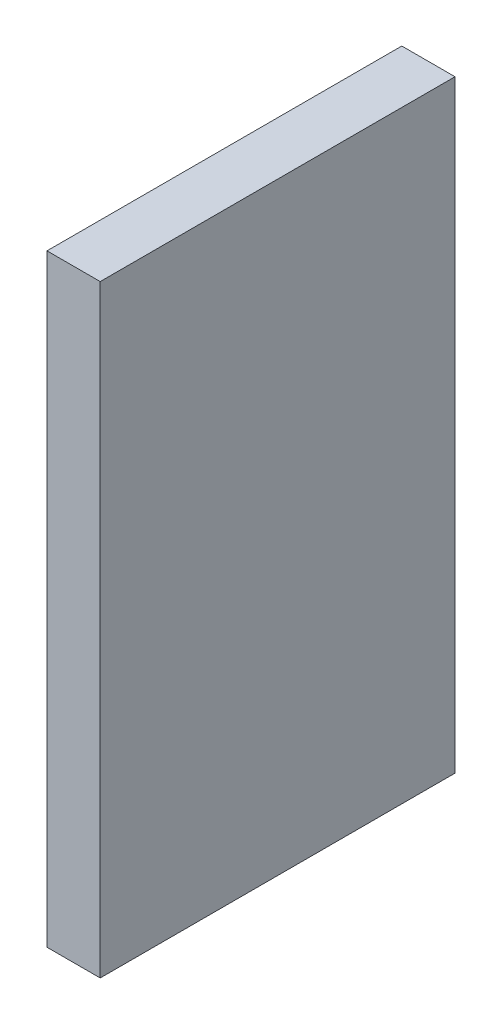
ISO-10303-21;
HEADER;
FILE_DESCRIPTION(('STEP AP214'),'2;1');
FILE_NAME('part.step','',(''),(''),'','','');
FILE_SCHEMA(('AUTOMOTIVE_DESIGN { 1 0 10303 214 1 1 1 1 }'));
ENDSEC;
DATA;
#1=APPLICATION_CONTEXT('core data for automotive mechanical design processes');
#2=APPLICATION_PROTOCOL_DEFINITION('international standard','automotive_design',2000,#1);
#3=PRODUCT_CONTEXT('',#1,'mechanical');
#4=PRODUCT('Part','Part','',(#3));
#5=PRODUCT_RELATED_PRODUCT_CATEGORY('part','',(#4));
#6=PRODUCT_DEFINITION_FORMATION('','',#4);
#7=PRODUCT_DEFINITION_CONTEXT('part definition',#1,'design');
#8=PRODUCT_DEFINITION('design','',#6,#7);
#9=PRODUCT_DEFINITION_SHAPE('','',#8);
#10=(LENGTH_UNIT() NAMED_UNIT(*) SI_UNIT(.MILLI.,.METRE.));
#11=(NAMED_UNIT(*) PLANE_ANGLE_UNIT() SI_UNIT($,.RADIAN.));
#12=(NAMED_UNIT(*) SI_UNIT($,.STERADIAN.) SOLID_ANGLE_UNIT());
#13=UNCERTAINTY_MEASURE_WITH_UNIT(LENGTH_MEASURE(1.E-05),#10,'distance_accuracy_value','');
#14=(GEOMETRIC_REPRESENTATION_CONTEXT(3) GLOBAL_UNCERTAINTY_ASSIGNED_CONTEXT((#13)) GLOBAL_UNIT_ASSIGNED_CONTEXT((#10,
#11,#12)) REPRESENTATION_CONTEXT('',''));
#15=CARTESIAN_POINT('',(0.,0.,0.));
#16=DIRECTION('',(0.,0.,1.));
#17=DIRECTION('',(1.,0.,0.));
#18=AXIS2_PLACEMENT_3D('',#15,#16,#17);
#19=CARTESIAN_POINT('',(-36.4742457530838,170.,41.2355989693083));
#20=DIRECTION('',(1.,0.,0.));
#21=DIRECTION('',(0.,0.,-1.));
#22=AXIS2_PLACEMENT_3D('',#19,#20,#21);
#23=PLANE('',#22);
#24=DIRECTION('',(0.,0.,1.));
#25=VECTOR('',#24,1.);
#26=CARTESIAN_POINT('',(-36.4742457530838,0.,41.2355989693083));
#27=LINE('',#26,#25);
#28=CARTESIAN_POINT('',(-36.4742457530838,0.,-58.7644010306917));
#29=VERTEX_POINT('',#28);
#30=CARTESIAN_POINT('',(-36.4742457530838,0.,41.2355989693083));
#31=VERTEX_POINT('',#30);
#32=EDGE_CURVE('E96',#29,#31,#27,.T.);
#33=ORIENTED_EDGE('',*,*,#32,.T.);
#34=DIRECTION('',(0.,-1.,0.));
#35=VECTOR('',#34,1.);
#36=CARTESIAN_POINT('',(-36.4742457530838,170.,41.2355989693083));
#37=LINE('',#36,#35);
#38=CARTESIAN_POINT('',(-36.4742457530838,170.,41.2355989693083));
#39=VERTEX_POINT('',#38);
#40=EDGE_CURVE('E11',#39,#31,#37,.T.);
#41=ORIENTED_EDGE('',*,*,#40,.F.);
#42=DIRECTION('',(0.,0.,1.));
#43=VECTOR('',#42,1.);
#44=CARTESIAN_POINT('',(-36.4742457530838,170.,41.2355989693083));
#45=LINE('',#44,#43);
#46=CARTESIAN_POINT('',(-36.4742457530838,170.,-58.7644010306917));
#47=VERTEX_POINT('',#46);
#48=EDGE_CURVE('E84',#47,#39,#45,.T.);
#49=ORIENTED_EDGE('',*,*,#48,.F.);
#50=DIRECTION('',(0.,-1.,0.));
#51=VECTOR('',#50,1.);
#52=CARTESIAN_POINT('',(-36.4742457530838,170.,-58.7644010306917));
#53=LINE('',#52,#51);
#54=EDGE_CURVE('E92',#47,#29,#53,.T.);
#55=ORIENTED_EDGE('',*,*,#54,.T.);
#56=EDGE_LOOP('',(#33,#41,#49,#55));
#57=FACE_BOUND('',#56,.T.);
#58=ADVANCED_FACE('F33',(#57),#23,.F.);
#59=CARTESIAN_POINT('',(-36.4742457530838,170.,41.2355989693083));
#60=DIRECTION('',(0.,0.,-1.));
#61=DIRECTION('',(-1.,0.,0.));
#62=AXIS2_PLACEMENT_3D('',#59,#60,#61);
#63=PLANE('',#62);
#64=DIRECTION('',(1.,0.,0.));
#65=VECTOR('',#64,1.);
#66=CARTESIAN_POINT('',(-36.4742457530838,0.,41.2355989693083));
#67=LINE('',#66,#65);
#68=CARTESIAN_POINT('',(-21.4742457530838,0.,41.2355989693083));
#69=VERTEX_POINT('',#68);
#70=EDGE_CURVE('E88',#31,#69,#67,.T.);
#71=ORIENTED_EDGE('',*,*,#70,.T.);
#72=DIRECTION('',(0.,-1.,0.));
#73=VECTOR('',#72,1.);
#74=CARTESIAN_POINT('',(-21.4742457530838,170.,41.2355989693083));
#75=LINE('',#74,#73);
#76=CARTESIAN_POINT('',(-21.4742457530838,170.,41.2355989693083));
#77=VERTEX_POINT('',#76);
#78=EDGE_CURVE('E41',#77,#69,#75,.T.);
#79=ORIENTED_EDGE('',*,*,#78,.F.);
#80=DIRECTION('',(1.,0.,0.));
#81=VECTOR('',#80,1.);
#82=CARTESIAN_POINT('',(-36.4742457530838,170.,41.2355989693083));
#83=LINE('',#82,#81);
#84=EDGE_CURVE('E79',#39,#77,#83,.T.);
#85=ORIENTED_EDGE('',*,*,#84,.F.);
#86=ORIENTED_EDGE('',*,*,#40,.T.);
#87=EDGE_LOOP('',(#71,#79,#85,#86));
#88=FACE_BOUND('',#87,.T.);
#89=ADVANCED_FACE('F87',(#88),#63,.F.);
#90=CARTESIAN_POINT('',(-21.4742457530838,170.,41.2355989693083));
#91=DIRECTION('',(-1.,0.,0.));
#92=DIRECTION('',(0.,0.,1.));
#93=AXIS2_PLACEMENT_3D('',#90,#91,#92);
#94=PLANE('',#93);
#95=DIRECTION('',(0.,0.,-1.));
#96=VECTOR('',#95,1.);
#97=CARTESIAN_POINT('',(-21.4742457530838,0.,41.2355989693083));
#98=LINE('',#97,#96);
#99=CARTESIAN_POINT('',(-21.4742457530838,0.,-58.7644010306917));
#100=VERTEX_POINT('',#99);
#101=EDGE_CURVE('E66',#69,#100,#98,.T.);
#102=ORIENTED_EDGE('',*,*,#101,.T.);
#103=DIRECTION('',(0.,-1.,0.));
#104=VECTOR('',#103,1.);
#105=CARTESIAN_POINT('',(-21.4742457530838,170.,-58.7644010306917));
#106=LINE('',#105,#104);
#107=CARTESIAN_POINT('',(-21.4742457530838,170.,-58.7644010306917));
#108=VERTEX_POINT('',#107);
#109=EDGE_CURVE('E89',#108,#100,#106,.T.);
#110=ORIENTED_EDGE('',*,*,#109,.F.);
#111=DIRECTION('',(0.,0.,-1.));
#112=VECTOR('',#111,1.);
#113=CARTESIAN_POINT('',(-21.4742457530838,170.,41.2355989693083));
#114=LINE('',#113,#112);
#115=EDGE_CURVE('E82',#77,#108,#114,.T.);
#116=ORIENTED_EDGE('',*,*,#115,.F.);
#117=ORIENTED_EDGE('',*,*,#78,.T.);
#118=EDGE_LOOP('',(#102,#110,#116,#117));
#119=FACE_BOUND('',#118,.T.);
#120=ADVANCED_FACE('F90',(#119),#94,.F.);
#121=CARTESIAN_POINT('',(-36.4742457530838,170.,-58.7644010306917));
#122=DIRECTION('',(0.,0.,1.));
#123=DIRECTION('',(1.,0.,0.));
#124=AXIS2_PLACEMENT_3D('',#121,#122,#123);
#125=PLANE('',#124);
#126=DIRECTION('',(-1.,0.,0.));
#127=VECTOR('',#126,1.);
#128=CARTESIAN_POINT('',(-36.4742457530838,0.,-58.7644010306917));
#129=LINE('',#128,#127);
#130=EDGE_CURVE('E72',#100,#29,#129,.T.);
#131=ORIENTED_EDGE('',*,*,#130,.T.);
#132=ORIENTED_EDGE('',*,*,#54,.F.);
#133=DIRECTION('',(-1.,0.,0.));
#134=VECTOR('',#133,1.);
#135=CARTESIAN_POINT('',(-36.4742457530838,170.,-58.7644010306917));
#136=LINE('',#135,#134);
#137=EDGE_CURVE('E49',#108,#47,#136,.T.);
#138=ORIENTED_EDGE('',*,*,#137,.F.);
#139=ORIENTED_EDGE('',*,*,#109,.T.);
#140=EDGE_LOOP('',(#131,#132,#138,#139));
#141=FACE_BOUND('',#140,.T.);
#142=ADVANCED_FACE('F103',(#141),#125,.F.);
#143=CARTESIAN_POINT('',(0.,170.,0.));
#144=DIRECTION('',(0.,-1.,0.));
#145=DIRECTION('',(0.,0.,-1.));
#146=AXIS2_PLACEMENT_3D('',#143,#144,#145);
#147=PLANE('',#146);
#148=ORIENTED_EDGE('',*,*,#48,.T.);
#149=ORIENTED_EDGE('',*,*,#84,.T.);
#150=ORIENTED_EDGE('',*,*,#115,.T.);
#151=ORIENTED_EDGE('',*,*,#137,.T.);
#152=EDGE_LOOP('',(#148,#149,#150,#151));
#153=FACE_BOUND('',#152,.T.);
#154=ADVANCED_FACE('F80',(#153),#147,.F.);
#155=CARTESIAN_POINT('',(0.,0.,0.));
#156=DIRECTION('',(0.,-1.,0.));
#157=DIRECTION('',(0.,0.,-1.));
#158=AXIS2_PLACEMENT_3D('',#155,#156,#157);
#159=PLANE('',#158);
#160=ORIENTED_EDGE('',*,*,#32,.F.);
#161=ORIENTED_EDGE('',*,*,#130,.F.);
#162=ORIENTED_EDGE('',*,*,#101,.F.);
#163=ORIENTED_EDGE('',*,*,#70,.F.);
#164=EDGE_LOOP('',(#160,#161,#162,#163));
#165=FACE_BOUND('',#164,.T.);
#166=ADVANCED_FACE('F106',(#165),#159,.T.);
#167=CLOSED_SHELL('',(#58,#89,#120,#142,#154,#166));
#168=MANIFOLD_SOLID_BREP('B2',#167);
#169=ADVANCED_BREP_SHAPE_REPRESENTATION('',(#18,#168),#14);
#170=SHAPE_DEFINITION_REPRESENTATION(#9,#169);
ENDSEC;
END-ISO-10303-21;
